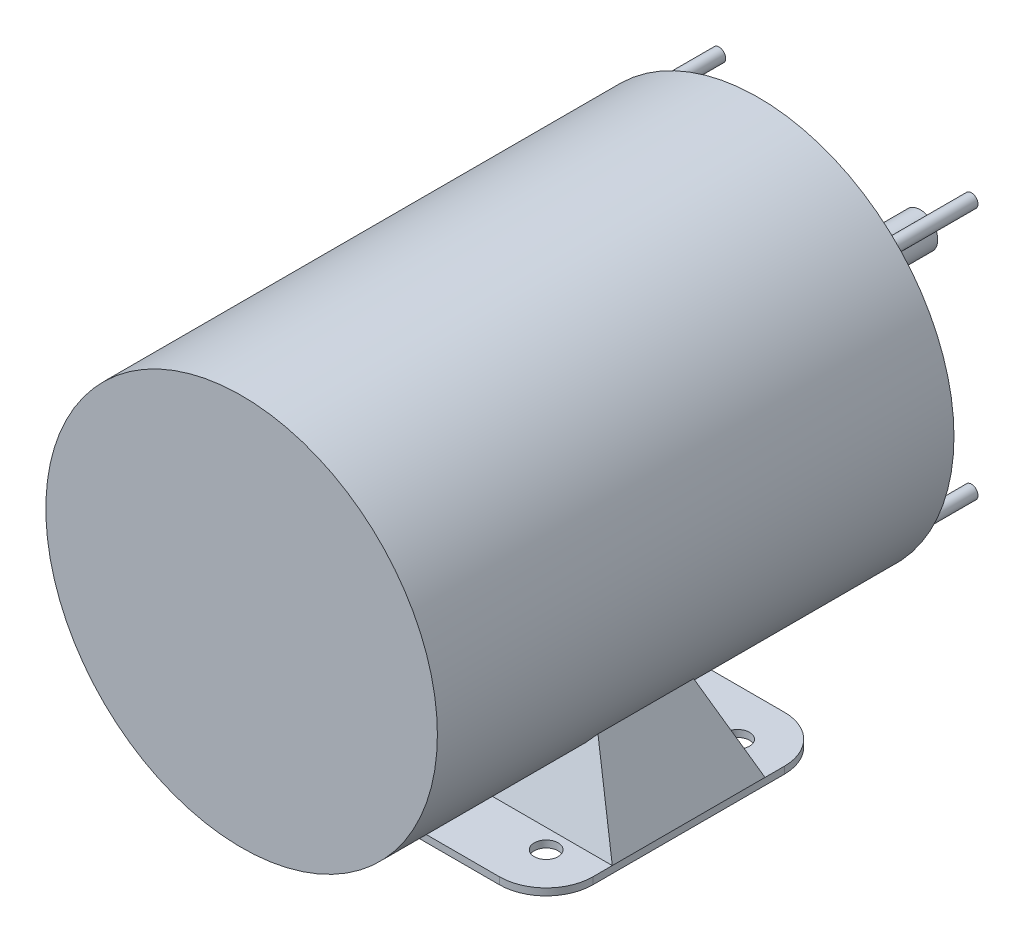
ISO-10303-21;
HEADER;
FILE_DESCRIPTION(('STEP AP214'),'2;1');
FILE_NAME('part.step','',(''),(''),'','','');
FILE_SCHEMA(('AUTOMOTIVE_DESIGN { 1 0 10303 214 1 1 1 1 }'));
ENDSEC;
DATA;
#1=APPLICATION_CONTEXT('core data for automotive mechanical design processes');
#2=APPLICATION_PROTOCOL_DEFINITION('international standard','automotive_design',2000,#1);
#3=PRODUCT_CONTEXT('',#1,'mechanical');
#4=PRODUCT('Part','Part','',(#3));
#5=PRODUCT_RELATED_PRODUCT_CATEGORY('part','',(#4));
#6=PRODUCT_DEFINITION_FORMATION('','',#4);
#7=PRODUCT_DEFINITION_CONTEXT('part definition',#1,'design');
#8=PRODUCT_DEFINITION('design','',#6,#7);
#9=PRODUCT_DEFINITION_SHAPE('','',#8);
#10=(LENGTH_UNIT() NAMED_UNIT(*) SI_UNIT(.MILLI.,.METRE.));
#11=(NAMED_UNIT(*) PLANE_ANGLE_UNIT() SI_UNIT($,.RADIAN.));
#12=(NAMED_UNIT(*) SI_UNIT($,.STERADIAN.) SOLID_ANGLE_UNIT());
#13=UNCERTAINTY_MEASURE_WITH_UNIT(LENGTH_MEASURE(1.E-05),#10,'distance_accuracy_value','');
#14=(GEOMETRIC_REPRESENTATION_CONTEXT(3) GLOBAL_UNCERTAINTY_ASSIGNED_CONTEXT((#13)) GLOBAL_UNIT_ASSIGNED_CONTEXT((#10,
#11,#12)) REPRESENTATION_CONTEXT('',''));
#15=CARTESIAN_POINT('',(0.,0.,0.));
#16=DIRECTION('',(0.,0.,1.));
#17=DIRECTION('',(1.,0.,0.));
#18=AXIS2_PLACEMENT_3D('',#15,#16,#17);
#19=CARTESIAN_POINT('',(-133.668926202755,-93729.1580129838,34023.6015015473));
#20=DIRECTION('',(0.,0.342020143325666,0.93969262078591));
#21=DIRECTION('',(0.,-0.93969262078591,0.342020143325666));
#22=AXIS2_PLACEMENT_3D('',#19,#20,#21);
#23=PLANE('',#22);
#24=DIRECTION('',(0.457149514050112,-0.835753087774445,0.304189247145964));
#25=VECTOR('',#24,1.);
#26=CARTESIAN_POINT('',(40550.9172218498,-74078.2868567643,26871.2693232832));
#27=LINE('',#26,#25);
#28=CARTESIAN_POINT('',(55.4135288647998,-45.085,-74.6125000000575));
#29=VERTEX_POINT('',#28);
#30=CARTESIAN_POINT('',(71.043799999984,-73.660000000018,-64.212050555895));
#31=VERTEX_POINT('',#30);
#32=EDGE_CURVE('E60',#29,#31,#27,.T.);
#33=ORIENTED_EDGE('',*,*,#32,.F.);
#34=CARTESIAN_POINT('',(0.,0.,-91.0220980119592));
#35=DIRECTION('',(0.,0.342020143325666,0.93969262078591));
#36=DIRECTION('',(0.,-0.93969262078591,0.342020143325666));
#37=AXIS2_PLACEMENT_3D('',#34,#35,#36);
#38=ELLIPSE('',#37,76.0221996212479,71.4375);
#39=CARTESIAN_POINT('',(-55.413528864802,-45.0850000000143,-74.6125000000581));
#40=VERTEX_POINT('',#39);
#41=EDGE_CURVE('E11',#29,#40,#38,.F.);
#42=ORIENTED_EDGE('',*,*,#41,.T.);
#43=DIRECTION('',(-0.457149514050112,-0.835753087774444,0.304189247145964));
#44=VECTOR('',#43,1.);
#45=CARTESIAN_POINT('',(-40606.7870042423,-74180.4270575362,26908.4453160862));
#46=LINE('',#45,#44);
#47=CARTESIAN_POINT('',(-71.043799999984,-73.660000000009,-64.2120505559024));
#48=VERTEX_POINT('',#47);
#49=EDGE_CURVE('E170',#40,#48,#46,.T.);
#50=ORIENTED_EDGE('',*,*,#49,.T.);
#51=DIRECTION('',(1.,0.,0.));
#52=VECTOR('',#51,1.);
#53=CARTESIAN_POINT('',(-133.668926202755,-73.660000000018,-64.212050555895));
#54=LINE('',#53,#52);
#55=EDGE_CURVE('E293',#48,#31,#54,.T.);
#56=ORIENTED_EDGE('',*,*,#55,.T.);
#57=EDGE_LOOP('',(#33,#42,#50,#56));
#58=FACE_BOUND('',#57,.T.);
#59=ADVANCED_FACE('F45',(#58),#23,.T.);
#60=CARTESIAN_POINT('',(-133.668926202755,93599.7479716558,33974.3942945125));
#61=DIRECTION('',(0.,0.342020143325666,-0.93969262078591));
#62=DIRECTION('',(0.,0.93969262078591,0.342020143325666));
#63=AXIS2_PLACEMENT_3D('',#60,#61,#62);
#64=PLANE('',#63);
#65=DIRECTION('',(-0.457149514050112,0.835753087774445,0.304189247145964));
#66=VECTOR('',#65,1.);
#67=CARTESIAN_POINT('',(-40502.1429193249,74101.5606649131,26877.6344927112));
#68=LINE('',#67,#66);
#69=CARTESIAN_POINT('',(71.043799999984,-73.66,-119.93794944425));
#70=VERTEX_POINT('',#69);
#71=CARTESIAN_POINT('',(55.4135288647984,-45.0850000000001,-109.537500000061));
#72=VERTEX_POINT('',#71);
#73=EDGE_CURVE('E139',#70,#72,#68,.T.);
#74=ORIENTED_EDGE('',*,*,#73,.F.);
#75=DIRECTION('',(1.,0.,0.));
#76=VECTOR('',#75,1.);
#77=CARTESIAN_POINT('',(-133.668926202755,-73.6600000000038,-119.937949444221));
#78=LINE('',#77,#76);
#79=CARTESIAN_POINT('',(-71.0437999999733,-73.6599999999877,-119.937949444214));
#80=VERTEX_POINT('',#79);
#81=EDGE_CURVE('E289',#80,#70,#78,.T.);
#82=ORIENTED_EDGE('',*,*,#81,.F.);
#83=DIRECTION('',(0.457149514050112,0.835753087774444,0.304189247145964));
#84=VECTOR('',#83,1.);
#85=CARTESIAN_POINT('',(40446.2731369324,73999.4204641413,26840.4584999083));
#86=LINE('',#85,#84);
#87=CARTESIAN_POINT('',(-55.4135288648042,-45.085,-109.537500000044));
#88=VERTEX_POINT('',#87);
#89=EDGE_CURVE('E141',#80,#88,#86,.T.);
#90=ORIENTED_EDGE('',*,*,#89,.T.);
#91=CARTESIAN_POINT('',(0.,0.,-93.1279019881698));
#92=DIRECTION('',(0.,0.342020143325666,-0.93969262078591));
#93=DIRECTION('',(0.,0.93969262078591,0.342020143325666));
#94=AXIS2_PLACEMENT_3D('',#91,#92,#93);
#95=ELLIPSE('',#94,76.0221996212479,71.4375);
#96=EDGE_CURVE('E134',#88,#72,#95,.F.);
#97=ORIENTED_EDGE('',*,*,#96,.T.);
#98=EDGE_LOOP('',(#74,#82,#90,#97));
#99=FACE_BOUND('',#98,.T.);
#100=ADVANCED_FACE('F136',(#99),#64,.T.);
#101=CARTESIAN_POINT('',(0.,0.,-188.4934));
#102=DIRECTION('',(0.,0.,1.));
#103=DIRECTION('',(1.,0.,0.));
#104=AXIS2_PLACEMENT_3D('',#101,#102,#103);
#105=CYLINDRICAL_SURFACE('',#104,71.4375);
#106=ORIENTED_EDGE('',*,*,#41,.F.);
#107=DIRECTION('',(0.,0.,1.));
#108=VECTOR('',#107,1.);
#109=CARTESIAN_POINT('',(55.4135288647998,-45.085,-188.4934));
#110=LINE('',#109,#108);
#111=EDGE_CURVE('E144',#72,#29,#110,.T.);
#112=ORIENTED_EDGE('',*,*,#111,.F.);
#113=ORIENTED_EDGE('',*,*,#96,.F.);
#114=DIRECTION('',(0.,0.,1.));
#115=VECTOR('',#114,1.);
#116=CARTESIAN_POINT('',(-55.4135288647998,-45.085,-188.4934));
#117=LINE('',#116,#115);
#118=EDGE_CURVE('E54',#40,#88,#117,.F.);
#119=ORIENTED_EDGE('',*,*,#118,.F.);
#120=EDGE_LOOP('',(#106,#112,#113,#119));
#121=FACE_BOUND('',#120,.T.);
#122=CARTESIAN_POINT('',(0.,0.,-188.4934));
#123=DIRECTION('',(0.,0.,1.));
#124=DIRECTION('',(1.,0.,0.));
#125=AXIS2_PLACEMENT_3D('',#122,#123,#124);
#126=CIRCLE('',#125,71.4375);
#127=CARTESIAN_POINT('',(71.4375,0.,-188.4934));
#128=VERTEX_POINT('',#127);
#129=EDGE_CURVE('E145',#128,#128,#126,.T.);
#130=ORIENTED_EDGE('',*,*,#129,.T.);
#131=EDGE_LOOP('',(#130));
#132=FACE_BOUND('',#131,.T.);
#133=CARTESIAN_POINT('',(0.,0.,0.));
#134=DIRECTION('',(0.,0.,1.));
#135=DIRECTION('',(1.,0.,0.));
#136=AXIS2_PLACEMENT_3D('',#133,#134,#135);
#137=CIRCLE('',#136,71.4375);
#138=CARTESIAN_POINT('',(71.4375,0.,0.));
#139=VERTEX_POINT('',#138);
#140=EDGE_CURVE('E303',#139,#139,#137,.T.);
#141=ORIENTED_EDGE('',*,*,#140,.F.);
#142=EDGE_LOOP('',(#141));
#143=FACE_BOUND('',#142,.T.);
#144=ADVANCED_FACE('F47',(#121,#132,#143),#105,.T.);
#145=CARTESIAN_POINT('',(0.,0.,-188.4934));
#146=DIRECTION('',(0.,0.,1.));
#147=DIRECTION('',(1.,0.,0.));
#148=AXIS2_PLACEMENT_3D('',#145,#146,#147);
#149=PLANE('',#148);
#150=CARTESIAN_POINT('',(-46.0375,-46.0375,-188.4934));
#151=DIRECTION('',(0.,0.,1.));
#152=DIRECTION('',(1.,0.,0.));
#153=AXIS2_PLACEMENT_3D('',#150,#151,#152);
#154=CIRCLE('',#153,2.413);
#155=CARTESIAN_POINT('',(-43.6245,-46.0375,-188.4934));
#156=VERTEX_POINT('',#155);
#157=EDGE_CURVE('E680',#156,#156,#154,.T.);
#158=ORIENTED_EDGE('',*,*,#157,.T.);
#159=EDGE_LOOP('',(#158));
#160=FACE_BOUND('',#159,.T.);
#161=CARTESIAN_POINT('',(-46.0375,46.0375,-188.4934));
#162=DIRECTION('',(0.,0.,1.));
#163=DIRECTION('',(1.,0.,0.));
#164=AXIS2_PLACEMENT_3D('',#161,#162,#163);
#165=CIRCLE('',#164,2.413);
#166=CARTESIAN_POINT('',(-43.6245,46.0375,-188.4934));
#167=VERTEX_POINT('',#166);
#168=EDGE_CURVE('E704',#167,#167,#165,.T.);
#169=ORIENTED_EDGE('',*,*,#168,.T.);
#170=EDGE_LOOP('',(#169));
#171=FACE_BOUND('',#170,.T.);
#172=CARTESIAN_POINT('',(46.0375,46.0375,-188.4934));
#173=DIRECTION('',(0.,0.,1.));
#174=DIRECTION('',(1.,0.,0.));
#175=AXIS2_PLACEMENT_3D('',#172,#173,#174);
#176=CIRCLE('',#175,2.413);
#177=CARTESIAN_POINT('',(48.4505,46.0375,-188.4934));
#178=VERTEX_POINT('',#177);
#179=EDGE_CURVE('E693',#178,#178,#176,.T.);
#180=ORIENTED_EDGE('',*,*,#179,.T.);
#181=EDGE_LOOP('',(#180));
#182=FACE_BOUND('',#181,.T.);
#183=CARTESIAN_POINT('',(46.0375,-46.0375,-188.4934));
#184=DIRECTION('',(0.,0.,1.));
#185=DIRECTION('',(1.,0.,0.));
#186=AXIS2_PLACEMENT_3D('',#183,#184,#185);
#187=CIRCLE('',#186,2.41299999999999);
#188=CARTESIAN_POINT('',(48.4505,-46.0375,-188.4934));
#189=VERTEX_POINT('',#188);
#190=EDGE_CURVE('E690',#189,#189,#187,.T.);
#191=ORIENTED_EDGE('',*,*,#190,.T.);
#192=EDGE_LOOP('',(#191));
#193=FACE_BOUND('',#192,.T.);
#194=CARTESIAN_POINT('',(0.,0.,-188.4934));
#195=DIRECTION('',(0.,0.,1.));
#196=DIRECTION('',(1.,0.,0.));
#197=AXIS2_PLACEMENT_3D('',#194,#195,#196);
#198=CIRCLE('',#197,6.35);
#199=CARTESIAN_POINT('',(6.35,0.,-188.4934));
#200=VERTEX_POINT('',#199);
#201=EDGE_CURVE('E296',#200,#200,#198,.T.);
#202=ORIENTED_EDGE('',*,*,#201,.T.);
#203=EDGE_LOOP('',(#202));
#204=FACE_BOUND('',#203,.T.);
#205=ORIENTED_EDGE('',*,*,#129,.F.);
#206=EDGE_LOOP('',(#205));
#207=FACE_BOUND('',#206,.T.);
#208=ADVANCED_FACE('F370',(#160,#171,#182,#193,#204,#207),#149,.F.);
#209=CARTESIAN_POINT('',(0.,0.,0.));
#210=DIRECTION('',(0.,0.,1.));
#211=DIRECTION('',(1.,0.,0.));
#212=AXIS2_PLACEMENT_3D('',#209,#210,#211);
#213=PLANE('',#212);
#214=ORIENTED_EDGE('',*,*,#140,.T.);
#215=EDGE_LOOP('',(#214));
#216=FACE_BOUND('',#215,.T.);
#217=ADVANCED_FACE('F368',(#216),#213,.T.);
#218=CARTESIAN_POINT('',(0.,0.,-247.65));
#219=DIRECTION('',(0.,0.,1.));
#220=DIRECTION('',(1.,0.,0.));
#221=AXIS2_PLACEMENT_3D('',#218,#219,#220);
#222=CYLINDRICAL_SURFACE('',#221,6.35);
#223=CARTESIAN_POINT('',(0.,0.,-247.65));
#224=DIRECTION('',(0.,0.,1.));
#225=DIRECTION('',(1.,0.,0.));
#226=AXIS2_PLACEMENT_3D('',#223,#224,#225);
#227=CIRCLE('',#226,6.35);
#228=CARTESIAN_POINT('',(6.35,0.,-247.65));
#229=VERTEX_POINT('',#228);
#230=EDGE_CURVE('E299',#229,#229,#227,.T.);
#231=ORIENTED_EDGE('',*,*,#230,.T.);
#232=EDGE_LOOP('',(#231));
#233=FACE_BOUND('',#232,.T.);
#234=ORIENTED_EDGE('',*,*,#201,.F.);
#235=EDGE_LOOP('',(#234));
#236=FACE_BOUND('',#235,.T.);
#237=ADVANCED_FACE('F364',(#233,#236),#222,.T.);
#238=CARTESIAN_POINT('',(0.,0.,-247.65));
#239=DIRECTION('',(0.,0.,1.));
#240=DIRECTION('',(1.,0.,0.));
#241=AXIS2_PLACEMENT_3D('',#238,#239,#240);
#242=PLANE('',#241);
#243=ORIENTED_EDGE('',*,*,#230,.F.);
#244=EDGE_LOOP('',(#243));
#245=FACE_BOUND('',#244,.T.);
#246=ADVANCED_FACE('F361',(#245),#242,.F.);
#247=CARTESIAN_POINT('',(71.043799999984,0.,0.));
#248=DIRECTION('',(1.,0.,0.));
#249=DIRECTION('',(0.,0.,-1.));
#250=AXIS2_PLACEMENT_3D('',#247,#248,#249);
#251=PLANE('',#250);
#252=DIRECTION('',(0.,0.,-1.));
#253=VECTOR('',#252,1.);
#254=CARTESIAN_POINT('',(71.043799999984,-73.66,495.487228121509));
#255=LINE('',#254,#253);
#256=EDGE_CURVE('E154',#31,#70,#255,.T.);
#257=ORIENTED_EDGE('',*,*,#256,.F.);
#258=DIRECTION('',(0.,0.,-1.));
#259=VECTOR('',#258,1.);
#260=CARTESIAN_POINT('',(71.043799999984,-73.66,291339.9675));
#261=LINE('',#260,#259);
#262=CARTESIAN_POINT('',(71.043799999984,-73.66,-57.1499999999787));
#263=VERTEX_POINT('',#262);
#264=EDGE_CURVE('E227',#263,#31,#261,.T.);
#265=ORIENTED_EDGE('',*,*,#264,.F.);
#266=DIRECTION('',(0.,-1.,0.));
#267=VECTOR('',#266,1.);
#268=CARTESIAN_POINT('',(71.043799999984,-73.66,-57.1499999999787));
#269=LINE('',#268,#267);
#270=CARTESIAN_POINT('',(71.043799999984,-76.2,-57.1499999999787));
#271=VERTEX_POINT('',#270);
#272=EDGE_CURVE('E265',#263,#271,#269,.T.);
#273=ORIENTED_EDGE('',*,*,#272,.T.);
#274=DIRECTION('',(0.,0.,-1.));
#275=VECTOR('',#274,1.);
#276=CARTESIAN_POINT('',(71.043799999984,-76.2,291339.9675));
#277=LINE('',#276,#275);
#278=CARTESIAN_POINT('',(71.0438,-76.2,-127.00000000001));
#279=VERTEX_POINT('',#278);
#280=EDGE_CURVE('E253',#271,#279,#277,.T.);
#281=ORIENTED_EDGE('',*,*,#280,.T.);
#282=DIRECTION('',(0.,-1.,0.));
#283=VECTOR('',#282,1.);
#284=CARTESIAN_POINT('',(71.0438,-73.66,-127.00000000001));
#285=LINE('',#284,#283);
#286=CARTESIAN_POINT('',(71.0438,-73.66,-127.00000000001));
#287=VERTEX_POINT('',#286);
#288=EDGE_CURVE('E261',#287,#279,#285,.T.);
#289=ORIENTED_EDGE('',*,*,#288,.F.);
#290=EDGE_CURVE('E226',#70,#287,#261,.T.);
#291=ORIENTED_EDGE('',*,*,#290,.F.);
#292=EDGE_LOOP('',(#257,#265,#273,#281,#289,#291));
#293=FACE_BOUND('',#292,.T.);
#294=ADVANCED_FACE('F341',(#293),#251,.T.);
#295=CARTESIAN_POINT('',(-71.043799999984,-73.66,291339.9675));
#296=DIRECTION('',(1.,0.,0.));
#297=DIRECTION('',(0.,0.,-1.));
#298=AXIS2_PLACEMENT_3D('',#295,#296,#297);
#299=PLANE('',#298);
#300=DIRECTION('',(0.,0.,1.));
#301=VECTOR('',#300,1.);
#302=CARTESIAN_POINT('',(-71.043799999984,-73.66,291339.9675));
#303=LINE('',#302,#301);
#304=CARTESIAN_POINT('',(-71.0438,-73.66,-57.1499999999787));
#305=VERTEX_POINT('',#304);
#306=EDGE_CURVE('E212',#48,#305,#303,.T.);
#307=ORIENTED_EDGE('',*,*,#306,.F.);
#308=DIRECTION('',(0.,0.,-1.));
#309=VECTOR('',#308,1.);
#310=CARTESIAN_POINT('',(-71.043799999984,-73.66,637.838353121436));
#311=LINE('',#310,#309);
#312=EDGE_CURVE('E159',#48,#80,#311,.T.);
#313=ORIENTED_EDGE('',*,*,#312,.T.);
#314=CARTESIAN_POINT('',(-71.043799999984,-73.66,-127.00000000001));
#315=VERTEX_POINT('',#314);
#316=EDGE_CURVE('E213',#315,#80,#303,.T.);
#317=ORIENTED_EDGE('',*,*,#316,.F.);
#318=DIRECTION('',(0.,-1.,0.));
#319=VECTOR('',#318,1.);
#320=CARTESIAN_POINT('',(-71.043799999984,-73.66,-127.00000000001));
#321=LINE('',#320,#319);
#322=CARTESIAN_POINT('',(-71.043799999984,-76.2,-127.00000000001));
#323=VERTEX_POINT('',#322);
#324=EDGE_CURVE('E281',#315,#323,#321,.T.);
#325=ORIENTED_EDGE('',*,*,#324,.T.);
#326=DIRECTION('',(0.,0.,1.));
#327=VECTOR('',#326,1.);
#328=CARTESIAN_POINT('',(-71.043799999984,-76.2,291339.9675));
#329=LINE('',#328,#327);
#330=CARTESIAN_POINT('',(-71.0438,-76.2,-57.1499999999787));
#331=VERTEX_POINT('',#330);
#332=EDGE_CURVE('E241',#323,#331,#329,.T.);
#333=ORIENTED_EDGE('',*,*,#332,.T.);
#334=DIRECTION('',(0.,-1.,0.));
#335=VECTOR('',#334,1.);
#336=CARTESIAN_POINT('',(-71.0438,-73.66,-57.1499999999787));
#337=LINE('',#336,#335);
#338=EDGE_CURVE('E277',#305,#331,#337,.T.);
#339=ORIENTED_EDGE('',*,*,#338,.F.);
#340=EDGE_LOOP('',(#307,#313,#317,#325,#333,#339));
#341=FACE_BOUND('',#340,.T.);
#342=ADVANCED_FACE('F323',(#341),#299,.F.);
#343=CARTESIAN_POINT('',(-53.975,-73.66,-127.));
#344=DIRECTION('',(0.,1.,0.));
#345=DIRECTION('',(0.,0.,1.));
#346=AXIS2_PLACEMENT_3D('',#343,#344,#345);
#347=PLANE('',#346);
#348=CARTESIAN_POINT('',(53.975,-73.66,-57.15));
#349=DIRECTION('',(0.,1.,0.));
#350=DIRECTION('',(0.,0.,1.));
#351=AXIS2_PLACEMENT_3D('',#348,#349,#350);
#352=CIRCLE('',#351,4.36562499999998);
#353=CARTESIAN_POINT('',(53.975,-73.66,-52.784375));
#354=VERTEX_POINT('',#353);
#355=EDGE_CURVE('E191',#354,#354,#352,.T.);
#356=ORIENTED_EDGE('',*,*,#355,.F.);
#357=EDGE_LOOP('',(#356));
#358=FACE_BOUND('',#357,.T.);
#359=CARTESIAN_POINT('',(-53.975,-73.66,-57.15));
#360=DIRECTION('',(0.,1.,0.));
#361=DIRECTION('',(0.,0.,1.));
#362=AXIS2_PLACEMENT_3D('',#359,#360,#361);
#363=CIRCLE('',#362,4.36562499999998);
#364=CARTESIAN_POINT('',(-53.975,-73.66,-52.784375));
#365=VERTEX_POINT('',#364);
#366=EDGE_CURVE('E183',#365,#365,#363,.T.);
#367=ORIENTED_EDGE('',*,*,#366,.F.);
#368=EDGE_LOOP('',(#367));
#369=FACE_BOUND('',#368,.T.);
#370=ORIENTED_EDGE('',*,*,#55,.F.);
#371=ORIENTED_EDGE('',*,*,#306,.T.);
#372=CARTESIAN_POINT('',(-53.975,-73.66,-57.15));
#373=DIRECTION('',(0.,1.,0.));
#374=DIRECTION('',(0.,0.,1.));
#375=AXIS2_PLACEMENT_3D('',#372,#373,#374);
#376=CIRCLE('',#375,17.0688);
#377=CARTESIAN_POINT('',(-53.9749999999799,-73.66,-40.0811999999692));
#378=VERTEX_POINT('',#377);
#379=EDGE_CURVE('E217',#305,#378,#376,.T.);
#380=ORIENTED_EDGE('',*,*,#379,.T.);
#381=DIRECTION('',(1.,0.,0.));
#382=VECTOR('',#381,1.);
#383=CARTESIAN_POINT('',(-400000.,-73.66,-40.0811999999178));
#384=LINE('',#383,#382);
#385=CARTESIAN_POINT('',(53.9750000000367,-73.66,-40.0812));
#386=VERTEX_POINT('',#385);
#387=EDGE_CURVE('E220',#378,#386,#384,.T.);
#388=ORIENTED_EDGE('',*,*,#387,.T.);
#389=CARTESIAN_POINT('',(53.975,-73.66,-57.15));
#390=DIRECTION('',(0.,1.,0.));
#391=DIRECTION('',(0.,0.,1.));
#392=AXIS2_PLACEMENT_3D('',#389,#390,#391);
#393=CIRCLE('',#392,17.0688);
#394=EDGE_CURVE('E223',#386,#263,#393,.T.);
#395=ORIENTED_EDGE('',*,*,#394,.T.);
#396=ORIENTED_EDGE('',*,*,#264,.T.);
#397=EDGE_LOOP('',(#370,#371,#380,#388,#395,#396));
#398=FACE_BOUND('',#397,.T.);
#399=ADVANCED_FACE('F319',(#358,#369,#398),#347,.T.);
#400=CARTESIAN_POINT('',(-53.975,-76.2,-127.));
#401=DIRECTION('',(0.,1.,0.));
#402=DIRECTION('',(0.,0.,1.));
#403=AXIS2_PLACEMENT_3D('',#400,#401,#402);
#404=PLANE('',#403);
#405=CARTESIAN_POINT('',(-53.975,-76.2,-127.));
#406=DIRECTION('',(0.,-1.,0.));
#407=DIRECTION('',(0.,0.,-1.));
#408=AXIS2_PLACEMENT_3D('',#405,#406,#407);
#409=CIRCLE('',#408,4.36562499999999);
#410=CARTESIAN_POINT('',(-53.975,-76.2,-131.365625));
#411=VERTEX_POINT('',#410);
#412=EDGE_CURVE('E174',#411,#411,#409,.T.);
#413=ORIENTED_EDGE('',*,*,#412,.F.);
#414=EDGE_LOOP('',(#413));
#415=FACE_BOUND('',#414,.T.);
#416=CARTESIAN_POINT('',(-53.975,-76.2,-57.15));
#417=DIRECTION('',(0.,-1.,0.));
#418=DIRECTION('',(0.,0.,-1.));
#419=AXIS2_PLACEMENT_3D('',#416,#417,#418);
#420=CIRCLE('',#419,4.36562499999999);
#421=CARTESIAN_POINT('',(-53.975,-76.2,-61.515625));
#422=VERTEX_POINT('',#421);
#423=EDGE_CURVE('E179',#422,#422,#420,.T.);
#424=ORIENTED_EDGE('',*,*,#423,.F.);
#425=EDGE_LOOP('',(#424));
#426=FACE_BOUND('',#425,.T.);
#427=CARTESIAN_POINT('',(53.975,-76.2,-127.));
#428=DIRECTION('',(0.,-1.,0.));
#429=DIRECTION('',(0.,0.,-1.));
#430=AXIS2_PLACEMENT_3D('',#427,#428,#429);
#431=CIRCLE('',#430,4.36562499999999);
#432=CARTESIAN_POINT('',(53.975,-76.2,-131.365625));
#433=VERTEX_POINT('',#432);
#434=EDGE_CURVE('E195',#433,#433,#431,.T.);
#435=ORIENTED_EDGE('',*,*,#434,.F.);
#436=EDGE_LOOP('',(#435));
#437=FACE_BOUND('',#436,.T.);
#438=DIRECTION('',(-1.,0.,0.));
#439=VECTOR('',#438,1.);
#440=CARTESIAN_POINT('',(-400000.,-76.2,-144.068800000014));
#441=LINE('',#440,#439);
#442=CARTESIAN_POINT('',(53.9750000000367,-76.2,-144.0688));
#443=VERTEX_POINT('',#442);
#444=CARTESIAN_POINT('',(-53.9750000000367,-76.2,-144.0688));
#445=VERTEX_POINT('',#444);
#446=EDGE_CURVE('E203',#443,#445,#441,.T.);
#447=ORIENTED_EDGE('',*,*,#446,.F.);
#448=CARTESIAN_POINT('',(53.975,-76.2,-127.));
#449=DIRECTION('',(0.,1.,0.));
#450=DIRECTION('',(0.,0.,1.));
#451=AXIS2_PLACEMENT_3D('',#448,#449,#450);
#452=CIRCLE('',#451,17.0688);
#453=EDGE_CURVE('E209',#279,#443,#452,.T.);
#454=ORIENTED_EDGE('',*,*,#453,.F.);
#455=ORIENTED_EDGE('',*,*,#280,.F.);
#456=CARTESIAN_POINT('',(53.975,-76.2,-57.15));
#457=DIRECTION('',(0.,1.,0.));
#458=DIRECTION('',(0.,0.,1.));
#459=AXIS2_PLACEMENT_3D('',#456,#457,#458);
#460=CIRCLE('',#459,17.0688);
#461=CARTESIAN_POINT('',(53.9750000000367,-76.2,-40.0812));
#462=VERTEX_POINT('',#461);
#463=EDGE_CURVE('E250',#462,#271,#460,.T.);
#464=ORIENTED_EDGE('',*,*,#463,.F.);
#465=DIRECTION('',(1.,0.,0.));
#466=VECTOR('',#465,1.);
#467=CARTESIAN_POINT('',(-400000.,-76.2,-40.0811999999178));
#468=LINE('',#467,#466);
#469=CARTESIAN_POINT('',(-53.9749999999799,-76.2,-40.0811999999692));
#470=VERTEX_POINT('',#469);
#471=EDGE_CURVE('E247',#470,#462,#468,.T.);
#472=ORIENTED_EDGE('',*,*,#471,.F.);
#473=CARTESIAN_POINT('',(-53.975,-76.2,-57.15));
#474=DIRECTION('',(0.,1.,0.));
#475=DIRECTION('',(0.,0.,1.));
#476=AXIS2_PLACEMENT_3D('',#473,#474,#475);
#477=CIRCLE('',#476,17.0688);
#478=EDGE_CURVE('E244',#331,#470,#477,.T.);
#479=ORIENTED_EDGE('',*,*,#478,.F.);
#480=ORIENTED_EDGE('',*,*,#332,.F.);
#481=CARTESIAN_POINT('',(-53.975,-76.2,-127.));
#482=DIRECTION('',(0.,1.,0.));
#483=DIRECTION('',(0.,0.,1.));
#484=AXIS2_PLACEMENT_3D('',#481,#482,#483);
#485=CIRCLE('',#484,17.0688);
#486=EDGE_CURVE('E238',#445,#323,#485,.T.);
#487=ORIENTED_EDGE('',*,*,#486,.F.);
#488=EDGE_LOOP('',(#447,#454,#455,#464,#472,#479,#480,#487));
#489=FACE_BOUND('',#488,.T.);
#490=CARTESIAN_POINT('',(53.975,-76.2,-57.15));
#491=DIRECTION('',(0.,-1.,0.));
#492=DIRECTION('',(0.,0.,-1.));
#493=AXIS2_PLACEMENT_3D('',#490,#491,#492);
#494=CIRCLE('',#493,4.36562499999999);
#495=CARTESIAN_POINT('',(53.975,-76.2,-61.515625));
#496=VERTEX_POINT('',#495);
#497=EDGE_CURVE('E187',#496,#496,#494,.T.);
#498=ORIENTED_EDGE('',*,*,#497,.F.);
#499=EDGE_LOOP('',(#498));
#500=FACE_BOUND('',#499,.T.);
#501=ADVANCED_FACE('F515',(#415,#426,#437,#489,#500),#404,.F.);
#502=CARTESIAN_POINT('',(-400000.,-73.66,-144.068800000014));
#503=DIRECTION('',(0.,0.,1.));
#504=DIRECTION('',(1.,0.,0.));
#505=AXIS2_PLACEMENT_3D('',#502,#503,#504);
#506=PLANE('',#505);
#507=ORIENTED_EDGE('',*,*,#446,.T.);
#508=DIRECTION('',(0.,-1.,0.));
#509=VECTOR('',#508,1.);
#510=CARTESIAN_POINT('',(-53.9750000000367,-73.66,-144.0688));
#511=LINE('',#510,#509);
#512=CARTESIAN_POINT('',(-53.9750000000367,-73.66,-144.0688));
#513=VERTEX_POINT('',#512);
#514=EDGE_CURVE('E285',#513,#445,#511,.T.);
#515=ORIENTED_EDGE('',*,*,#514,.F.);
#516=DIRECTION('',(-1.,0.,0.));
#517=VECTOR('',#516,1.);
#518=CARTESIAN_POINT('',(-400000.,-73.66,-144.068800000014));
#519=LINE('',#518,#517);
#520=CARTESIAN_POINT('',(53.9750000000367,-73.66,-144.0688));
#521=VERTEX_POINT('',#520);
#522=EDGE_CURVE('E204',#521,#513,#519,.T.);
#523=ORIENTED_EDGE('',*,*,#522,.F.);
#524=DIRECTION('',(0.,-1.,0.));
#525=VECTOR('',#524,1.);
#526=CARTESIAN_POINT('',(53.9750000000367,-73.66,-144.0688));
#527=LINE('',#526,#525);
#528=EDGE_CURVE('E234',#521,#443,#527,.T.);
#529=ORIENTED_EDGE('',*,*,#528,.T.);
#530=EDGE_LOOP('',(#507,#515,#523,#529));
#531=FACE_BOUND('',#530,.T.);
#532=ADVANCED_FACE('F594',(#531),#506,.F.);
#533=CARTESIAN_POINT('',(-53.975,-73.66,-127.));
#534=DIRECTION('',(0.,-1.,0.));
#535=DIRECTION('',(0.,0.,-1.));
#536=AXIS2_PLACEMENT_3D('',#533,#534,#535);
#537=CYLINDRICAL_SURFACE('',#536,17.0688);
#538=ORIENTED_EDGE('',*,*,#486,.T.);
#539=ORIENTED_EDGE('',*,*,#324,.F.);
#540=CARTESIAN_POINT('',(-53.975,-73.66,-127.));
#541=DIRECTION('',(0.,1.,0.));
#542=DIRECTION('',(0.,0.,1.));
#543=AXIS2_PLACEMENT_3D('',#540,#541,#542);
#544=CIRCLE('',#543,17.0688);
#545=EDGE_CURVE('E208',#513,#315,#544,.T.);
#546=ORIENTED_EDGE('',*,*,#545,.F.);
#547=ORIENTED_EDGE('',*,*,#514,.T.);
#548=EDGE_LOOP('',(#538,#539,#546,#547));
#549=FACE_BOUND('',#548,.T.);
#550=ADVANCED_FACE('F587',(#549),#537,.T.);
#551=CARTESIAN_POINT('',(-53.975,-73.66,-57.15));
#552=DIRECTION('',(0.,-1.,0.));
#553=DIRECTION('',(0.,0.,-1.));
#554=AXIS2_PLACEMENT_3D('',#551,#552,#553);
#555=CYLINDRICAL_SURFACE('',#554,17.0688);
#556=ORIENTED_EDGE('',*,*,#478,.T.);
#557=DIRECTION('',(0.,-1.,0.));
#558=VECTOR('',#557,1.);
#559=CARTESIAN_POINT('',(-53.9749999999799,-73.66,-40.0811999999692));
#560=LINE('',#559,#558);
#561=EDGE_CURVE('E273',#378,#470,#560,.T.);
#562=ORIENTED_EDGE('',*,*,#561,.F.);
#563=ORIENTED_EDGE('',*,*,#379,.F.);
#564=ORIENTED_EDGE('',*,*,#338,.T.);
#565=EDGE_LOOP('',(#556,#562,#563,#564));
#566=FACE_BOUND('',#565,.T.);
#567=ADVANCED_FACE('F327',(#566),#555,.T.);
#568=CARTESIAN_POINT('',(-400000.,-73.66,-40.0811999999178));
#569=DIRECTION('',(0.,0.,-1.));
#570=DIRECTION('',(-1.,0.,0.));
#571=AXIS2_PLACEMENT_3D('',#568,#569,#570);
#572=PLANE('',#571);
#573=ORIENTED_EDGE('',*,*,#471,.T.);
#574=DIRECTION('',(0.,-1.,0.));
#575=VECTOR('',#574,1.);
#576=CARTESIAN_POINT('',(53.9750000000367,-73.66,-40.0812));
#577=LINE('',#576,#575);
#578=EDGE_CURVE('E269',#386,#462,#577,.T.);
#579=ORIENTED_EDGE('',*,*,#578,.F.);
#580=ORIENTED_EDGE('',*,*,#387,.F.);
#581=ORIENTED_EDGE('',*,*,#561,.T.);
#582=EDGE_LOOP('',(#573,#579,#580,#581));
#583=FACE_BOUND('',#582,.T.);
#584=ADVANCED_FACE('F332',(#583),#572,.F.);
#585=CARTESIAN_POINT('',(53.975,-73.66,-57.15));
#586=DIRECTION('',(0.,-1.,0.));
#587=DIRECTION('',(0.,0.,-1.));
#588=AXIS2_PLACEMENT_3D('',#585,#586,#587);
#589=CYLINDRICAL_SURFACE('',#588,17.0688);
#590=ORIENTED_EDGE('',*,*,#463,.T.);
#591=ORIENTED_EDGE('',*,*,#272,.F.);
#592=ORIENTED_EDGE('',*,*,#394,.F.);
#593=ORIENTED_EDGE('',*,*,#578,.T.);
#594=EDGE_LOOP('',(#590,#591,#592,#593));
#595=FACE_BOUND('',#594,.T.);
#596=ADVANCED_FACE('F337',(#595),#589,.T.);
#597=CARTESIAN_POINT('',(53.975,-73.66,-127.));
#598=DIRECTION('',(0.,-1.,0.));
#599=DIRECTION('',(0.,0.,-1.));
#600=AXIS2_PLACEMENT_3D('',#597,#598,#599);
#601=CYLINDRICAL_SURFACE('',#600,17.0688);
#602=ORIENTED_EDGE('',*,*,#453,.T.);
#603=ORIENTED_EDGE('',*,*,#528,.F.);
#604=CARTESIAN_POINT('',(53.975,-73.66,-127.));
#605=DIRECTION('',(0.,1.,0.));
#606=DIRECTION('',(0.,0.,1.));
#607=AXIS2_PLACEMENT_3D('',#604,#605,#606);
#608=CIRCLE('',#607,17.0688);
#609=EDGE_CURVE('E231',#287,#521,#608,.T.);
#610=ORIENTED_EDGE('',*,*,#609,.F.);
#611=ORIENTED_EDGE('',*,*,#288,.T.);
#612=EDGE_LOOP('',(#602,#603,#610,#611));
#613=FACE_BOUND('',#612,.T.);
#614=ADVANCED_FACE('F506',(#613),#601,.T.);
#615=CARTESIAN_POINT('',(-53.975,-73.66,-127.));
#616=DIRECTION('',(0.,1.,0.));
#617=DIRECTION('',(0.,0.,1.));
#618=AXIS2_PLACEMENT_3D('',#615,#616,#617);
#619=CIRCLE('',#618,4.36562499999998);
#620=CARTESIAN_POINT('',(-53.975,-73.66,-122.634375));
#621=VERTEX_POINT('',#620);
#622=EDGE_CURVE('E178',#621,#621,#619,.T.);
#623=ORIENTED_EDGE('',*,*,#622,.F.);
#624=EDGE_LOOP('',(#623));
#625=FACE_BOUND('',#624,.T.);
#626=CARTESIAN_POINT('',(53.975,-73.66,-127.));
#627=DIRECTION('',(0.,1.,0.));
#628=DIRECTION('',(0.,0.,1.));
#629=AXIS2_PLACEMENT_3D('',#626,#627,#628);
#630=CIRCLE('',#629,4.36562499999998);
#631=CARTESIAN_POINT('',(53.975,-73.66,-122.634375));
#632=VERTEX_POINT('',#631);
#633=EDGE_CURVE('E199',#632,#632,#630,.T.);
#634=ORIENTED_EDGE('',*,*,#633,.F.);
#635=EDGE_LOOP('',(#634));
#636=FACE_BOUND('',#635,.T.);
#637=ORIENTED_EDGE('',*,*,#316,.T.);
#638=ORIENTED_EDGE('',*,*,#81,.T.);
#639=ORIENTED_EDGE('',*,*,#290,.T.);
#640=ORIENTED_EDGE('',*,*,#609,.T.);
#641=ORIENTED_EDGE('',*,*,#522,.T.);
#642=ORIENTED_EDGE('',*,*,#545,.T.);
#643=EDGE_LOOP('',(#637,#638,#639,#640,#641,#642));
#644=FACE_BOUND('',#643,.T.);
#645=ADVANCED_FACE('F346',(#625,#636,#644),#347,.T.);
#646=CARTESIAN_POINT('',(53.975,-76.2,-127.));
#647=DIRECTION('',(0.,-1.,0.));
#648=DIRECTION('',(0.,0.,-1.));
#649=AXIS2_PLACEMENT_3D('',#646,#647,#648);
#650=CYLINDRICAL_SURFACE('',#649,4.36562499999998);
#651=ORIENTED_EDGE('',*,*,#633,.T.);
#652=EDGE_LOOP('',(#651));
#653=FACE_BOUND('',#652,.T.);
#654=ORIENTED_EDGE('',*,*,#434,.T.);
#655=EDGE_LOOP('',(#654));
#656=FACE_BOUND('',#655,.T.);
#657=ADVANCED_FACE('F505',(#653,#656),#650,.F.);
#658=CARTESIAN_POINT('',(53.975,-76.2,-57.15));
#659=DIRECTION('',(0.,-1.,0.));
#660=DIRECTION('',(0.,0.,-1.));
#661=AXIS2_PLACEMENT_3D('',#658,#659,#660);
#662=CYLINDRICAL_SURFACE('',#661,4.36562499999998);
#663=ORIENTED_EDGE('',*,*,#355,.T.);
#664=EDGE_LOOP('',(#663));
#665=FACE_BOUND('',#664,.T.);
#666=ORIENTED_EDGE('',*,*,#497,.T.);
#667=EDGE_LOOP('',(#666));
#668=FACE_BOUND('',#667,.T.);
#669=ADVANCED_FACE('F548',(#665,#668),#662,.F.);
#670=CARTESIAN_POINT('',(-53.975,-76.2,-57.15));
#671=DIRECTION('',(0.,-1.,0.));
#672=DIRECTION('',(0.,0.,-1.));
#673=AXIS2_PLACEMENT_3D('',#670,#671,#672);
#674=CYLINDRICAL_SURFACE('',#673,4.36562499999998);
#675=ORIENTED_EDGE('',*,*,#366,.T.);
#676=EDGE_LOOP('',(#675));
#677=FACE_BOUND('',#676,.T.);
#678=ORIENTED_EDGE('',*,*,#423,.T.);
#679=EDGE_LOOP('',(#678));
#680=FACE_BOUND('',#679,.T.);
#681=ADVANCED_FACE('F541',(#677,#680),#674,.F.);
#682=CARTESIAN_POINT('',(-53.975,-76.2,-127.));
#683=DIRECTION('',(0.,-1.,0.));
#684=DIRECTION('',(0.,0.,-1.));
#685=AXIS2_PLACEMENT_3D('',#682,#683,#684);
#686=CYLINDRICAL_SURFACE('',#685,4.36562499999998);
#687=ORIENTED_EDGE('',*,*,#622,.T.);
#688=EDGE_LOOP('',(#687));
#689=FACE_BOUND('',#688,.T.);
#690=ORIENTED_EDGE('',*,*,#412,.T.);
#691=EDGE_LOOP('',(#690));
#692=FACE_BOUND('',#691,.T.);
#693=ADVANCED_FACE('F406',(#689,#692),#686,.F.);
#694=CARTESIAN_POINT('',(-71.043799999984,-73.66,637.838353121436));
#695=DIRECTION('',(-0.877328250758066,0.479890758841835,0.));
#696=DIRECTION('',(-0.479890758841835,-0.877328250758066,0.));
#697=AXIS2_PLACEMENT_3D('',#694,#695,#696);
#698=PLANE('',#697);
#699=ORIENTED_EDGE('',*,*,#49,.F.);
#700=ORIENTED_EDGE('',*,*,#118,.T.);
#701=ORIENTED_EDGE('',*,*,#89,.F.);
#702=ORIENTED_EDGE('',*,*,#312,.F.);
#703=EDGE_LOOP('',(#699,#700,#701,#702));
#704=FACE_BOUND('',#703,.T.);
#705=ADVANCED_FACE('F350',(#704),#698,.T.);
#706=CARTESIAN_POINT('',(71.043799999984,-73.66,495.487228121509));
#707=DIRECTION('',(-0.877328250758066,-0.479890758841835,0.));
#708=DIRECTION('',(0.479890758841835,-0.877328250758066,0.));
#709=AXIS2_PLACEMENT_3D('',#706,#707,#708);
#710=PLANE('',#709);
#711=ORIENTED_EDGE('',*,*,#111,.T.);
#712=ORIENTED_EDGE('',*,*,#32,.T.);
#713=ORIENTED_EDGE('',*,*,#256,.T.);
#714=ORIENTED_EDGE('',*,*,#73,.T.);
#715=EDGE_LOOP('',(#711,#712,#713,#714));
#716=FACE_BOUND('',#715,.T.);
#717=ADVANCED_FACE('F153',(#716),#710,.F.);
#718=CARTESIAN_POINT('',(46.0375,-46.0375,-220.2434));
#719=DIRECTION('',(0.,0.,1.));
#720=DIRECTION('',(1.,0.,0.));
#721=AXIS2_PLACEMENT_3D('',#718,#719,#720);
#722=CYLINDRICAL_SURFACE('',#721,2.41299999999999);
#723=CARTESIAN_POINT('',(46.0375,-46.0375,-220.2434));
#724=DIRECTION('',(0.,0.,1.));
#725=DIRECTION('',(1.,0.,0.));
#726=AXIS2_PLACEMENT_3D('',#723,#724,#725);
#727=CIRCLE('',#726,2.41299999999999);
#728=CARTESIAN_POINT('',(48.4505,-46.0375,-220.2434));
#729=VERTEX_POINT('',#728);
#730=EDGE_CURVE('E161',#729,#729,#727,.T.);
#731=ORIENTED_EDGE('',*,*,#730,.T.);
#732=EDGE_LOOP('',(#731));
#733=FACE_BOUND('',#732,.T.);
#734=ORIENTED_EDGE('',*,*,#190,.F.);
#735=EDGE_LOOP('',(#734));
#736=FACE_BOUND('',#735,.T.);
#737=ADVANCED_FACE('F414',(#733,#736),#722,.T.);
#738=CARTESIAN_POINT('',(46.0375,-46.0375,-220.2434));
#739=DIRECTION('',(0.,0.,1.));
#740=DIRECTION('',(1.,0.,0.));
#741=AXIS2_PLACEMENT_3D('',#738,#739,#740);
#742=PLANE('',#741);
#743=ORIENTED_EDGE('',*,*,#730,.F.);
#744=EDGE_LOOP('',(#743));
#745=FACE_BOUND('',#744,.T.);
#746=ADVANCED_FACE('F422',(#745),#742,.F.);
#747=CARTESIAN_POINT('',(46.0375,46.0375,-220.2434));
#748=DIRECTION('',(0.,0.,1.));
#749=DIRECTION('',(1.,0.,0.));
#750=AXIS2_PLACEMENT_3D('',#747,#748,#749);
#751=CYLINDRICAL_SURFACE('',#750,2.413);
#752=CARTESIAN_POINT('',(46.0375,46.0375,-220.2434));
#753=DIRECTION('',(0.,0.,1.));
#754=DIRECTION('',(1.,0.,0.));
#755=AXIS2_PLACEMENT_3D('',#752,#753,#754);
#756=CIRCLE('',#755,2.413);
#757=CARTESIAN_POINT('',(48.4505,46.0375,-220.2434));
#758=VERTEX_POINT('',#757);
#759=EDGE_CURVE('E698',#758,#758,#756,.T.);
#760=ORIENTED_EDGE('',*,*,#759,.T.);
#761=EDGE_LOOP('',(#760));
#762=FACE_BOUND('',#761,.T.);
#763=ORIENTED_EDGE('',*,*,#179,.F.);
#764=EDGE_LOOP('',(#763));
#765=FACE_BOUND('',#764,.T.);
#766=ADVANCED_FACE('F431',(#762,#765),#751,.T.);
#767=CARTESIAN_POINT('',(46.0375,46.0375,-220.2434));
#768=DIRECTION('',(0.,0.,1.));
#769=DIRECTION('',(1.,0.,0.));
#770=AXIS2_PLACEMENT_3D('',#767,#768,#769);
#771=PLANE('',#770);
#772=ORIENTED_EDGE('',*,*,#759,.F.);
#773=EDGE_LOOP('',(#772));
#774=FACE_BOUND('',#773,.T.);
#775=ADVANCED_FACE('F440',(#774),#771,.F.);
#776=CARTESIAN_POINT('',(-46.0375,46.0375,-220.2434));
#777=DIRECTION('',(0.,0.,1.));
#778=DIRECTION('',(1.,0.,0.));
#779=AXIS2_PLACEMENT_3D('',#776,#777,#778);
#780=CYLINDRICAL_SURFACE('',#779,2.413);
#781=CARTESIAN_POINT('',(-46.0375,46.0375,-220.2434));
#782=DIRECTION('',(0.,0.,1.));
#783=DIRECTION('',(1.,0.,0.));
#784=AXIS2_PLACEMENT_3D('',#781,#782,#783);
#785=CIRCLE('',#784,2.413);
#786=CARTESIAN_POINT('',(-43.6245,46.0375,-220.2434));
#787=VERTEX_POINT('',#786);
#788=EDGE_CURVE('E684',#787,#787,#785,.T.);
#789=ORIENTED_EDGE('',*,*,#788,.T.);
#790=EDGE_LOOP('',(#789));
#791=FACE_BOUND('',#790,.T.);
#792=ORIENTED_EDGE('',*,*,#168,.F.);
#793=EDGE_LOOP('',(#792));
#794=FACE_BOUND('',#793,.T.);
#795=ADVANCED_FACE('F449',(#791,#794),#780,.T.);
#796=CARTESIAN_POINT('',(-46.0375,46.0375,-220.2434));
#797=DIRECTION('',(0.,0.,1.));
#798=DIRECTION('',(1.,0.,0.));
#799=AXIS2_PLACEMENT_3D('',#796,#797,#798);
#800=PLANE('',#799);
#801=ORIENTED_EDGE('',*,*,#788,.F.);
#802=EDGE_LOOP('',(#801));
#803=FACE_BOUND('',#802,.T.);
#804=ADVANCED_FACE('F458',(#803),#800,.F.);
#805=CARTESIAN_POINT('',(-46.0375,-46.0375,-220.2434));
#806=DIRECTION('',(0.,0.,1.));
#807=DIRECTION('',(1.,0.,0.));
#808=AXIS2_PLACEMENT_3D('',#805,#806,#807);
#809=CYLINDRICAL_SURFACE('',#808,2.413);
#810=CARTESIAN_POINT('',(-46.0375,-46.0375,-220.2434));
#811=DIRECTION('',(0.,0.,1.));
#812=DIRECTION('',(1.,0.,0.));
#813=AXIS2_PLACEMENT_3D('',#810,#811,#812);
#814=CIRCLE('',#813,2.413);
#815=CARTESIAN_POINT('',(-43.6245,-46.0375,-220.2434));
#816=VERTEX_POINT('',#815);
#817=EDGE_CURVE('E678',#816,#816,#814,.T.);
#818=ORIENTED_EDGE('',*,*,#817,.T.);
#819=EDGE_LOOP('',(#818));
#820=FACE_BOUND('',#819,.T.);
#821=ORIENTED_EDGE('',*,*,#157,.F.);
#822=EDGE_LOOP('',(#821));
#823=FACE_BOUND('',#822,.T.);
#824=ADVANCED_FACE('F467',(#820,#823),#809,.T.);
#825=CARTESIAN_POINT('',(-46.0375,-46.0375,-220.2434));
#826=DIRECTION('',(0.,0.,1.));
#827=DIRECTION('',(1.,0.,0.));
#828=AXIS2_PLACEMENT_3D('',#825,#826,#827);
#829=PLANE('',#828);
#830=ORIENTED_EDGE('',*,*,#817,.F.);
#831=EDGE_LOOP('',(#830));
#832=FACE_BOUND('',#831,.T.);
#833=ADVANCED_FACE('F476',(#832),#829,.F.);
#834=CLOSED_SHELL('',(#59,#100,#144,#208,#217,#237,#246,#294,#342,#399,#501,#532,#550,#567,#584,
#596,#614,#645,#657,#669,#681,#693,#705,#717,#737,#746,#766,#775,#795,#804,#824,#833));
#835=MANIFOLD_SOLID_BREP('B2',#834);
#836=ADVANCED_BREP_SHAPE_REPRESENTATION('',(#18,#835),#14);
#837=SHAPE_DEFINITION_REPRESENTATION(#9,#836);
ENDSEC;
END-ISO-10303-21;
